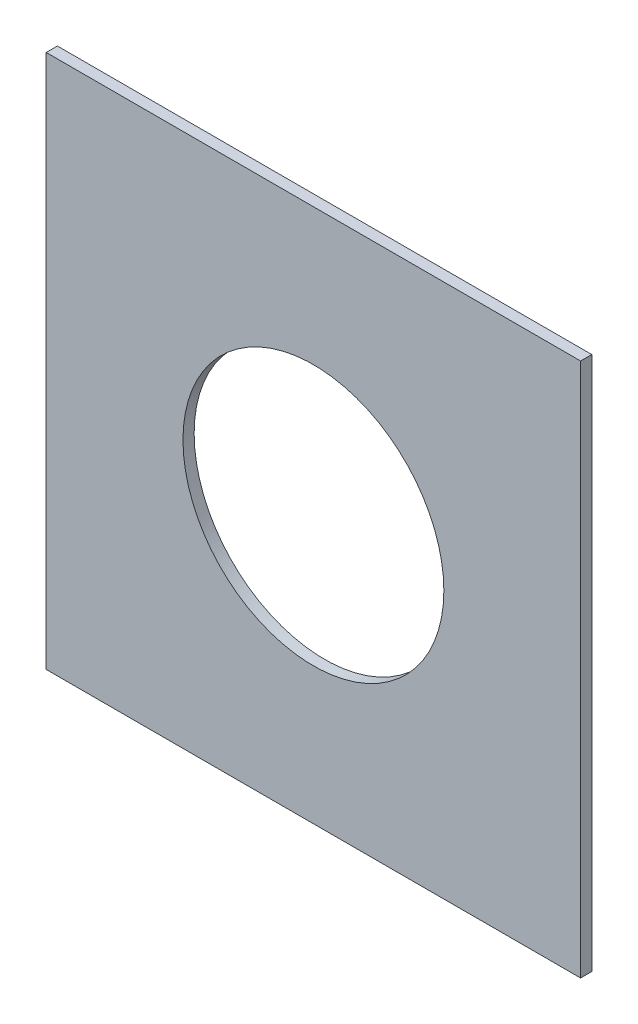
ISO-10303-21;
HEADER;
FILE_DESCRIPTION(('STEP AP214'),'2;1');
FILE_NAME('part.step','',(''),(''),'','','');
FILE_SCHEMA(('AUTOMOTIVE_DESIGN { 1 0 10303 214 1 1 1 1 }'));
ENDSEC;
DATA;
#1=APPLICATION_CONTEXT('core data for automotive mechanical design processes');
#2=APPLICATION_PROTOCOL_DEFINITION('international standard','automotive_design',2000,#1);
#3=PRODUCT_CONTEXT('',#1,'mechanical');
#4=PRODUCT('Part','Part','',(#3));
#5=PRODUCT_RELATED_PRODUCT_CATEGORY('part','',(#4));
#6=PRODUCT_DEFINITION_FORMATION('','',#4);
#7=PRODUCT_DEFINITION_CONTEXT('part definition',#1,'design');
#8=PRODUCT_DEFINITION('design','',#6,#7);
#9=PRODUCT_DEFINITION_SHAPE('','',#8);
#10=(LENGTH_UNIT() NAMED_UNIT(*) SI_UNIT(.MILLI.,.METRE.));
#11=(NAMED_UNIT(*) PLANE_ANGLE_UNIT() SI_UNIT($,.RADIAN.));
#12=(NAMED_UNIT(*) SI_UNIT($,.STERADIAN.) SOLID_ANGLE_UNIT());
#13=UNCERTAINTY_MEASURE_WITH_UNIT(LENGTH_MEASURE(1.E-05),#10,'distance_accuracy_value','');
#14=(GEOMETRIC_REPRESENTATION_CONTEXT(3) GLOBAL_UNCERTAINTY_ASSIGNED_CONTEXT((#13)) GLOBAL_UNIT_ASSIGNED_CONTEXT((#10,
#11,#12)) REPRESENTATION_CONTEXT('',''));
#15=CARTESIAN_POINT('',(0.,0.,0.));
#16=DIRECTION('',(0.,0.,1.));
#17=DIRECTION('',(1.,0.,0.));
#18=AXIS2_PLACEMENT_3D('',#15,#16,#17);
#19=CARTESIAN_POINT('',(36.2099990844727,114.349998474121,0.));
#20=DIRECTION('',(0.,-1.,0.));
#21=DIRECTION('',(-1.,0.,0.));
#22=AXIS2_PLACEMENT_3D('',#19,#20,#21);
#23=PLANE('',#22);
#24=DIRECTION('',(-1.,0.,0.));
#25=VECTOR('',#24,1.);
#26=CARTESIAN_POINT('',(36.2099990844727,114.349998474121,0.03556));
#27=LINE('',#26,#25);
#28=CARTESIAN_POINT('',(36.2099990844727,114.349998474121,0.03556));
#29=VERTEX_POINT('',#28);
#30=CARTESIAN_POINT('',(34.5099983215332,114.349998474121,0.03556));
#31=VERTEX_POINT('',#30);
#32=EDGE_CURVE('E11',#29,#31,#27,.T.);
#33=ORIENTED_EDGE('',*,*,#32,.F.);
#34=DIRECTION('',(0.,0.,1.));
#35=VECTOR('',#34,1.);
#36=CARTESIAN_POINT('',(36.2099990844727,114.349998474121,0.));
#37=LINE('',#36,#35);
#38=CARTESIAN_POINT('',(36.2099990844727,114.349998474121,0.));
#39=VERTEX_POINT('',#38);
#40=EDGE_CURVE('E24',#39,#29,#37,.T.);
#41=ORIENTED_EDGE('',*,*,#40,.F.);
#42=DIRECTION('',(-1.,0.,0.));
#43=VECTOR('',#42,1.);
#44=CARTESIAN_POINT('',(36.2099990844727,114.349998474121,0.));
#45=LINE('',#44,#43);
#46=CARTESIAN_POINT('',(34.5099983215332,114.349998474121,0.));
#47=VERTEX_POINT('',#46);
#48=EDGE_CURVE('E96',#39,#47,#45,.T.);
#49=ORIENTED_EDGE('',*,*,#48,.T.);
#50=DIRECTION('',(0.,0.,1.));
#51=VECTOR('',#50,1.);
#52=CARTESIAN_POINT('',(34.5099983215332,114.349998474121,0.));
#53=LINE('',#52,#51);
#54=EDGE_CURVE('E37',#47,#31,#53,.T.);
#55=ORIENTED_EDGE('',*,*,#54,.T.);
#56=EDGE_LOOP('',(#33,#41,#49,#55));
#57=FACE_BOUND('',#56,.T.);
#58=ADVANCED_FACE('F17',(#57),#23,.F.);
#59=CARTESIAN_POINT('',(34.5099983215332,114.349998474121,0.));
#60=DIRECTION('',(1.,0.,0.));
#61=DIRECTION('',(0.,-1.,0.));
#62=AXIS2_PLACEMENT_3D('',#59,#60,#61);
#63=PLANE('',#62);
#64=DIRECTION('',(0.,-1.,0.));
#65=VECTOR('',#64,1.);
#66=CARTESIAN_POINT('',(34.5099983215332,114.349998474121,0.03556));
#67=LINE('',#66,#65);
#68=CARTESIAN_POINT('',(34.5099983215332,112.650001525879,0.03556));
#69=VERTEX_POINT('',#68);
#70=EDGE_CURVE('E92',#31,#69,#67,.T.);
#71=ORIENTED_EDGE('',*,*,#70,.F.);
#72=ORIENTED_EDGE('',*,*,#54,.F.);
#73=DIRECTION('',(0.,-1.,0.));
#74=VECTOR('',#73,1.);
#75=CARTESIAN_POINT('',(34.5099983215332,114.349998474121,0.));
#76=LINE('',#75,#74);
#77=CARTESIAN_POINT('',(34.5099983215332,112.650001525879,0.));
#78=VERTEX_POINT('',#77);
#79=EDGE_CURVE('E89',#47,#78,#76,.T.);
#80=ORIENTED_EDGE('',*,*,#79,.T.);
#81=DIRECTION('',(0.,0.,1.));
#82=VECTOR('',#81,1.);
#83=CARTESIAN_POINT('',(34.5099983215332,112.650001525879,0.));
#84=LINE('',#83,#82);
#85=EDGE_CURVE('E87',#78,#69,#84,.T.);
#86=ORIENTED_EDGE('',*,*,#85,.T.);
#87=EDGE_LOOP('',(#71,#72,#80,#86));
#88=FACE_BOUND('',#87,.T.);
#89=ADVANCED_FACE('F104',(#88),#63,.F.);
#90=CARTESIAN_POINT('',(34.5099983215332,112.650001525879,0.));
#91=DIRECTION('',(0.,1.,0.));
#92=DIRECTION('',(1.,0.,0.));
#93=AXIS2_PLACEMENT_3D('',#90,#91,#92);
#94=PLANE('',#93);
#95=DIRECTION('',(1.,0.,0.));
#96=VECTOR('',#95,1.);
#97=CARTESIAN_POINT('',(34.5099983215332,112.650001525879,0.03556));
#98=LINE('',#97,#96);
#99=CARTESIAN_POINT('',(36.2099990844727,112.650001525879,0.03556));
#100=VERTEX_POINT('',#99);
#101=EDGE_CURVE('E84',#69,#100,#98,.T.);
#102=ORIENTED_EDGE('',*,*,#101,.F.);
#103=ORIENTED_EDGE('',*,*,#85,.F.);
#104=DIRECTION('',(1.,0.,0.));
#105=VECTOR('',#104,1.);
#106=CARTESIAN_POINT('',(34.5099983215332,112.650001525879,0.));
#107=LINE('',#106,#105);
#108=CARTESIAN_POINT('',(36.2099990844727,112.650001525879,0.));
#109=VERTEX_POINT('',#108);
#110=EDGE_CURVE('E81',#78,#109,#107,.T.);
#111=ORIENTED_EDGE('',*,*,#110,.T.);
#112=DIRECTION('',(0.,0.,1.));
#113=VECTOR('',#112,1.);
#114=CARTESIAN_POINT('',(36.2099990844727,112.650001525879,0.));
#115=LINE('',#114,#113);
#116=EDGE_CURVE('E79',#109,#100,#115,.T.);
#117=ORIENTED_EDGE('',*,*,#116,.T.);
#118=EDGE_LOOP('',(#102,#103,#111,#117));
#119=FACE_BOUND('',#118,.T.);
#120=ADVANCED_FACE('F110',(#119),#94,.F.);
#121=CARTESIAN_POINT('',(36.2099990844727,112.650001525879,0.));
#122=DIRECTION('',(-1.,0.,0.));
#123=DIRECTION('',(0.,1.,0.));
#124=AXIS2_PLACEMENT_3D('',#121,#122,#123);
#125=PLANE('',#124);
#126=DIRECTION('',(0.,1.,0.));
#127=VECTOR('',#126,1.);
#128=CARTESIAN_POINT('',(36.2099990844727,112.650001525879,0.03556));
#129=LINE('',#128,#127);
#130=EDGE_CURVE('E76',#100,#29,#129,.T.);
#131=ORIENTED_EDGE('',*,*,#130,.F.);
#132=ORIENTED_EDGE('',*,*,#116,.F.);
#133=DIRECTION('',(0.,1.,0.));
#134=VECTOR('',#133,1.);
#135=CARTESIAN_POINT('',(36.2099990844727,112.650001525879,0.));
#136=LINE('',#135,#134);
#137=EDGE_CURVE('E68',#109,#39,#136,.T.);
#138=ORIENTED_EDGE('',*,*,#137,.T.);
#139=ORIENTED_EDGE('',*,*,#40,.T.);
#140=EDGE_LOOP('',(#131,#132,#138,#139));
#141=FACE_BOUND('',#140,.T.);
#142=ADVANCED_FACE('F111',(#141),#125,.F.);
#143=CARTESIAN_POINT('',(35.3600004,113.5000016,0.));
#144=DIRECTION('',(0.,0.,-1.));
#145=DIRECTION('',(1.,0.,0.));
#146=AXIS2_PLACEMENT_3D('',#143,#144,#145);
#147=CYLINDRICAL_SURFACE('',#146,0.41500044);
#148=DIRECTION('',(0.,0.,1.));
#149=VECTOR('',#148,1.);
#150=CARTESIAN_POINT('',(35.77500084,113.5000016,0.));
#151=LINE('',#150,#149);
#152=CARTESIAN_POINT('',(35.77500084,113.5000016,0.));
#153=VERTEX_POINT('',#152);
#154=CARTESIAN_POINT('',(35.77500084,113.5000016,0.03556));
#155=VERTEX_POINT('',#154);
#156=EDGE_CURVE('E62',#153,#155,#151,.T.);
#157=ORIENTED_EDGE('',*,*,#156,.T.);
#158=CARTESIAN_POINT('',(35.3600004,113.5000016,0.03556));
#159=DIRECTION('',(0.,0.,1.));
#160=DIRECTION('',(1.,0.,0.));
#161=AXIS2_PLACEMENT_3D('',#158,#159,#160);
#162=CIRCLE('',#161,0.41500044);
#163=EDGE_CURVE('E67',#155,#155,#162,.T.);
#164=ORIENTED_EDGE('',*,*,#163,.T.);
#165=ORIENTED_EDGE('',*,*,#156,.F.);
#166=CARTESIAN_POINT('',(35.3600004,113.5000016,0.));
#167=DIRECTION('',(0.,0.,1.));
#168=DIRECTION('',(1.,0.,0.));
#169=AXIS2_PLACEMENT_3D('',#166,#167,#168);
#170=CIRCLE('',#169,0.41500044);
#171=EDGE_CURVE('E65',#153,#153,#170,.T.);
#172=ORIENTED_EDGE('',*,*,#171,.F.);
#173=EDGE_LOOP('',(#157,#164,#165,#172));
#174=FACE_BOUND('',#173,.T.);
#175=ADVANCED_FACE('F64',(#174),#147,.F.);
#176=CARTESIAN_POINT('',(36.2099990844727,114.349998474121,0.));
#177=DIRECTION('',(0.,0.,-1.));
#178=DIRECTION('',(-1.,0.,0.));
#179=AXIS2_PLACEMENT_3D('',#176,#177,#178);
#180=PLANE('',#179);
#181=ORIENTED_EDGE('',*,*,#137,.F.);
#182=ORIENTED_EDGE('',*,*,#110,.F.);
#183=ORIENTED_EDGE('',*,*,#79,.F.);
#184=ORIENTED_EDGE('',*,*,#48,.F.);
#185=EDGE_LOOP('',(#181,#182,#183,#184));
#186=FACE_BOUND('',#185,.T.);
#187=ORIENTED_EDGE('',*,*,#171,.T.);
#188=EDGE_LOOP('',(#187));
#189=FACE_BOUND('',#188,.T.);
#190=ADVANCED_FACE('F71',(#186,#189),#180,.T.);
#191=CARTESIAN_POINT('',(36.2099990844727,114.349998474121,0.03556));
#192=DIRECTION('',(0.,0.,-1.));
#193=DIRECTION('',(-1.,0.,0.));
#194=AXIS2_PLACEMENT_3D('',#191,#192,#193);
#195=PLANE('',#194);
#196=ORIENTED_EDGE('',*,*,#32,.T.);
#197=ORIENTED_EDGE('',*,*,#70,.T.);
#198=ORIENTED_EDGE('',*,*,#101,.T.);
#199=ORIENTED_EDGE('',*,*,#130,.T.);
#200=EDGE_LOOP('',(#196,#197,#198,#199));
#201=FACE_BOUND('',#200,.T.);
#202=ORIENTED_EDGE('',*,*,#163,.F.);
#203=EDGE_LOOP('',(#202));
#204=FACE_BOUND('',#203,.T.);
#205=ADVANCED_FACE('F107',(#201,#204),#195,.F.);
#206=CLOSED_SHELL('',(#58,#89,#120,#142,#175,#190,#205));
#207=MANIFOLD_SOLID_BREP('B1',#206);
#208=ADVANCED_BREP_SHAPE_REPRESENTATION('',(#18,#207),#14);
#209=SHAPE_DEFINITION_REPRESENTATION(#9,#208);
ENDSEC;
END-ISO-10303-21;
